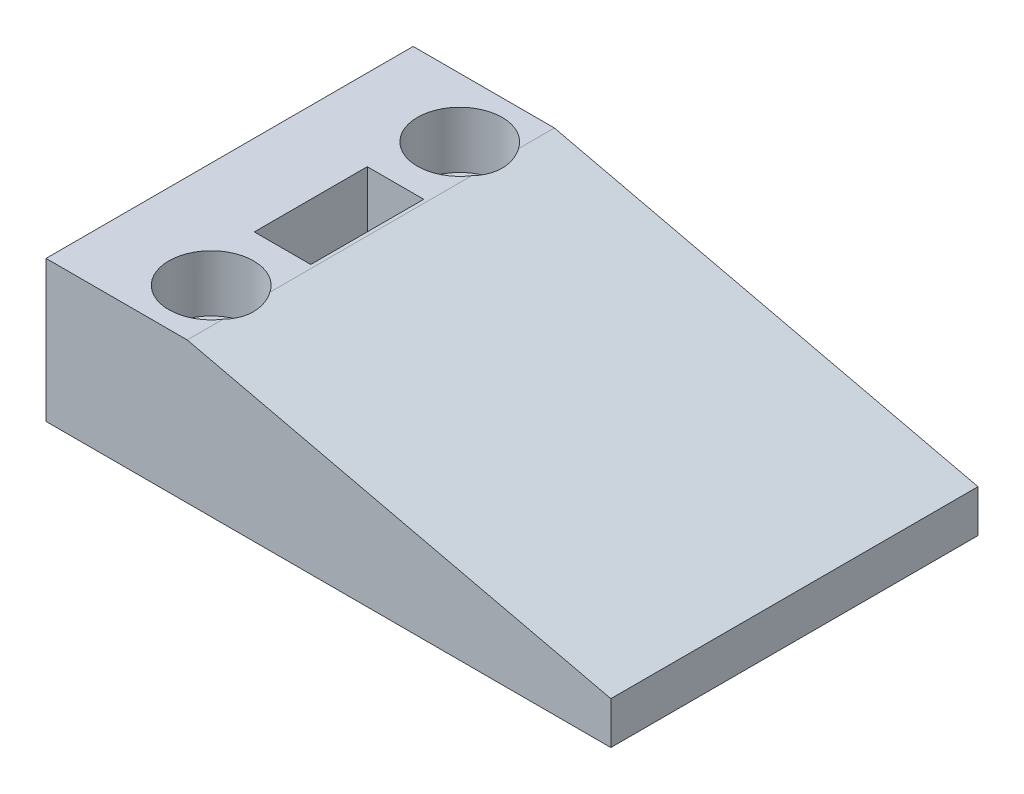
ISO-10303-21;
HEADER;
FILE_DESCRIPTION(('STEP AP214'),'2;1');
FILE_NAME('part.step','',(''),(''),'','','');
FILE_SCHEMA(('AUTOMOTIVE_DESIGN { 1 0 10303 214 1 1 1 1 }'));
ENDSEC;
DATA;
#1=APPLICATION_CONTEXT('core data for automotive mechanical design processes');
#2=APPLICATION_PROTOCOL_DEFINITION('international standard','automotive_design',2000,#1);
#3=PRODUCT_CONTEXT('',#1,'mechanical');
#4=PRODUCT('Part','Part','',(#3));
#5=PRODUCT_RELATED_PRODUCT_CATEGORY('part','',(#4));
#6=PRODUCT_DEFINITION_FORMATION('','',#4);
#7=PRODUCT_DEFINITION_CONTEXT('part definition',#1,'design');
#8=PRODUCT_DEFINITION('design','',#6,#7);
#9=PRODUCT_DEFINITION_SHAPE('','',#8);
#10=(LENGTH_UNIT() NAMED_UNIT(*) SI_UNIT(.MILLI.,.METRE.));
#11=(NAMED_UNIT(*) PLANE_ANGLE_UNIT() SI_UNIT($,.RADIAN.));
#12=(NAMED_UNIT(*) SI_UNIT($,.STERADIAN.) SOLID_ANGLE_UNIT());
#13=UNCERTAINTY_MEASURE_WITH_UNIT(LENGTH_MEASURE(1.E-05),#10,'distance_accuracy_value','');
#14=(GEOMETRIC_REPRESENTATION_CONTEXT(3) GLOBAL_UNCERTAINTY_ASSIGNED_CONTEXT((#13)) GLOBAL_UNIT_ASSIGNED_CONTEXT((#10,
#11,#12)) REPRESENTATION_CONTEXT('',''));
#15=CARTESIAN_POINT('',(0.,0.,0.));
#16=DIRECTION('',(0.,0.,1.));
#17=DIRECTION('',(1.,0.,0.));
#18=AXIS2_PLACEMENT_3D('',#15,#16,#17);
#19=CARTESIAN_POINT('',(7.5,10.,4.2));
#20=DIRECTION('',(0.,-1.,0.));
#21=DIRECTION('',(0.,0.,-1.));
#22=AXIS2_PLACEMENT_3D('',#19,#20,#21);
#23=CYLINDRICAL_SURFACE('',#22,1.725);
#24=CARTESIAN_POINT('',(7.5,0.,4.2));
#25=DIRECTION('',(0.,-1.,0.));
#26=DIRECTION('',(0.,0.,-1.));
#27=AXIS2_PLACEMENT_3D('',#24,#25,#26);
#28=CIRCLE('',#27,1.725);
#29=CARTESIAN_POINT('',(7.5,0.,2.475));
#30=VERTEX_POINT('',#29);
#31=EDGE_CURVE('E218',#30,#30,#28,.T.);
#32=ORIENTED_EDGE('',*,*,#31,.T.);
#33=EDGE_LOOP('',(#32));
#34=FACE_BOUND('',#33,.T.);
#35=CARTESIAN_POINT('',(7.5,6.,4.2));
#36=DIRECTION('',(0.,1.,0.));
#37=DIRECTION('',(-1.,0.,0.));
#38=AXIS2_PLACEMENT_3D('',#35,#36,#37);
#39=CIRCLE('',#38,1.725);
#40=CARTESIAN_POINT('',(5.775,6.,4.2));
#41=VERTEX_POINT('',#40);
#42=EDGE_CURVE('E45',#41,#41,#39,.F.);
#43=ORIENTED_EDGE('',*,*,#42,.F.);
#44=EDGE_LOOP('',(#43));
#45=FACE_BOUND('',#44,.T.);
#46=ADVANCED_FACE('F41',(#34,#45),#23,.F.);
#47=CARTESIAN_POINT('',(7.5,10.,21.8));
#48=DIRECTION('',(0.,-1.,0.));
#49=DIRECTION('',(0.,0.,-1.));
#50=AXIS2_PLACEMENT_3D('',#47,#48,#49);
#51=CYLINDRICAL_SURFACE('',#50,1.725);
#52=CARTESIAN_POINT('',(7.5,0.,21.8));
#53=DIRECTION('',(0.,-1.,0.));
#54=DIRECTION('',(0.,0.,-1.));
#55=AXIS2_PLACEMENT_3D('',#52,#53,#54);
#56=CIRCLE('',#55,1.725);
#57=CARTESIAN_POINT('',(7.5,0.,20.075));
#58=VERTEX_POINT('',#57);
#59=EDGE_CURVE('E172',#58,#58,#56,.T.);
#60=ORIENTED_EDGE('',*,*,#59,.T.);
#61=EDGE_LOOP('',(#60));
#62=FACE_BOUND('',#61,.T.);
#63=CARTESIAN_POINT('',(7.5,6.,21.8));
#64=DIRECTION('',(0.,1.,0.));
#65=DIRECTION('',(-1.,0.,0.));
#66=AXIS2_PLACEMENT_3D('',#63,#64,#65);
#67=CIRCLE('',#66,1.725);
#68=CARTESIAN_POINT('',(5.775,6.,21.8));
#69=VERTEX_POINT('',#68);
#70=EDGE_CURVE('E196',#69,#69,#67,.F.);
#71=ORIENTED_EDGE('',*,*,#70,.F.);
#72=EDGE_LOOP('',(#71));
#73=FACE_BOUND('',#72,.T.);
#74=ADVANCED_FACE('F305',(#62,#73),#51,.F.);
#75=CARTESIAN_POINT('',(2.72918861959958,11.6965226554268,26.));
#76=DIRECTION('',(0.227229615606418,0.973841209741793,0.));
#77=DIRECTION('',(-0.973841209741793,0.227229615606418,0.));
#78=AXIS2_PLACEMENT_3D('',#75,#76,#77);
#79=PLANE('',#78);
#80=CARTESIAN_POINT('',(7.5,10.5833333333333,4.2));
#81=DIRECTION('',(0.227229615606418,0.973841209741793,0.));
#82=DIRECTION('',(-0.973841209741793,0.227229615606418,0.));
#83=AXIS2_PLACEMENT_3D('',#80,#81,#82);
#84=ELLIPSE('',#83,3.08058436014987,3.);
#85=CARTESIAN_POINT('',(10.,10.,5.8583123951777));
#86=VERTEX_POINT('',#85);
#87=CARTESIAN_POINT('',(10.,10.,2.54168760482231));
#88=VERTEX_POINT('',#87);
#89=EDGE_CURVE('E59',#86,#88,#84,.T.);
#90=ORIENTED_EDGE('',*,*,#89,.F.);
#91=DIRECTION('',(0.,0.,-1.));
#92=VECTOR('',#91,1.);
#93=CARTESIAN_POINT('',(10.,10.,26.));
#94=LINE('',#93,#92);
#95=CARTESIAN_POINT('',(10.,10.,20.1416876048223));
#96=VERTEX_POINT('',#95);
#97=EDGE_CURVE('E51',#96,#86,#94,.T.);
#98=ORIENTED_EDGE('',*,*,#97,.F.);
#99=CARTESIAN_POINT('',(7.5,10.5833333333333,21.8));
#100=DIRECTION('',(0.227229615606418,0.973841209741793,0.));
#101=DIRECTION('',(-0.973841209741793,0.227229615606418,0.));
#102=AXIS2_PLACEMENT_3D('',#99,#100,#101);
#103=ELLIPSE('',#102,3.08058436014987,3.);
#104=CARTESIAN_POINT('',(10.,10.,23.4583123951777));
#105=VERTEX_POINT('',#104);
#106=EDGE_CURVE('E66',#105,#96,#103,.T.);
#107=ORIENTED_EDGE('',*,*,#106,.F.);
#108=CARTESIAN_POINT('',(10.,10.,26.));
#109=VERTEX_POINT('',#108);
#110=EDGE_CURVE('E11',#109,#105,#94,.T.);
#111=ORIENTED_EDGE('',*,*,#110,.F.);
#112=DIRECTION('',(0.973841209741793,-0.227229615606418,0.));
#113=VECTOR('',#112,1.);
#114=CARTESIAN_POINT('',(2.72918861959958,11.6965226554268,26.));
#115=LINE('',#114,#113);
#116=CARTESIAN_POINT('',(40.,3.,26.));
#117=VERTEX_POINT('',#116);
#118=EDGE_CURVE('E151',#109,#117,#115,.T.);
#119=ORIENTED_EDGE('',*,*,#118,.T.);
#120=DIRECTION('',(0.,0.,-1.));
#121=VECTOR('',#120,1.);
#122=CARTESIAN_POINT('',(40.,3.,26.));
#123=LINE('',#122,#121);
#124=CARTESIAN_POINT('',(40.,3.,0.));
#125=VERTEX_POINT('',#124);
#126=EDGE_CURVE('E166',#117,#125,#123,.T.);
#127=ORIENTED_EDGE('',*,*,#126,.T.);
#128=DIRECTION('',(0.973841209741793,-0.227229615606418,0.));
#129=VECTOR('',#128,1.);
#130=CARTESIAN_POINT('',(2.72918861959958,11.6965226554268,0.));
#131=LINE('',#130,#129);
#132=CARTESIAN_POINT('',(10.,10.,0.));
#133=VERTEX_POINT('',#132);
#134=EDGE_CURVE('E167',#133,#125,#131,.T.);
#135=ORIENTED_EDGE('',*,*,#134,.F.);
#136=EDGE_CURVE('E53',#88,#133,#94,.T.);
#137=ORIENTED_EDGE('',*,*,#136,.F.);
#138=EDGE_LOOP('',(#90,#98,#107,#111,#119,#127,#135,#137));
#139=FACE_BOUND('',#138,.T.);
#140=ADVANCED_FACE('F43',(#139),#79,.T.);
#141=CARTESIAN_POINT('',(0.,10.,26.));
#142=DIRECTION('',(0.,1.,0.));
#143=DIRECTION('',(-1.,0.,0.));
#144=AXIS2_PLACEMENT_3D('',#141,#142,#143);
#145=PLANE('',#144);
#146=CARTESIAN_POINT('',(7.5,10.,4.2));
#147=DIRECTION('',(0.,1.,0.));
#148=DIRECTION('',(-1.,0.,0.));
#149=AXIS2_PLACEMENT_3D('',#146,#147,#148);
#150=CIRCLE('',#149,3.);
#151=EDGE_CURVE('E206',#88,#86,#150,.T.);
#152=ORIENTED_EDGE('',*,*,#151,.F.);
#153=ORIENTED_EDGE('',*,*,#136,.T.);
#154=DIRECTION('',(1.,0.,0.));
#155=VECTOR('',#154,1.);
#156=CARTESIAN_POINT('',(0.,10.,0.));
#157=LINE('',#156,#155);
#158=CARTESIAN_POINT('',(0.,10.,0.));
#159=VERTEX_POINT('',#158);
#160=EDGE_CURVE('E171',#159,#133,#157,.T.);
#161=ORIENTED_EDGE('',*,*,#160,.F.);
#162=DIRECTION('',(0.,0.,-1.));
#163=VECTOR('',#162,1.);
#164=CARTESIAN_POINT('',(0.,10.,26.));
#165=LINE('',#164,#163);
#166=CARTESIAN_POINT('',(0.,10.,26.));
#167=VERTEX_POINT('',#166);
#168=EDGE_CURVE('E145',#167,#159,#165,.T.);
#169=ORIENTED_EDGE('',*,*,#168,.F.);
#170=DIRECTION('',(1.,0.,0.));
#171=VECTOR('',#170,1.);
#172=CARTESIAN_POINT('',(0.,10.,26.));
#173=LINE('',#172,#171);
#174=EDGE_CURVE('E143',#167,#109,#173,.T.);
#175=ORIENTED_EDGE('',*,*,#174,.T.);
#176=ORIENTED_EDGE('',*,*,#110,.T.);
#177=CARTESIAN_POINT('',(7.5,10.,21.8));
#178=DIRECTION('',(0.,1.,0.));
#179=DIRECTION('',(-1.,0.,0.));
#180=AXIS2_PLACEMENT_3D('',#177,#178,#179);
#181=CIRCLE('',#180,3.);
#182=EDGE_CURVE('E125',#96,#105,#181,.T.);
#183=ORIENTED_EDGE('',*,*,#182,.F.);
#184=ORIENTED_EDGE('',*,*,#97,.T.);
#185=EDGE_LOOP('',(#152,#153,#161,#169,#175,#176,#183,#184));
#186=FACE_BOUND('',#185,.T.);
#187=DIRECTION('',(0.,0.,-1.));
#188=VECTOR('',#187,1.);
#189=CARTESIAN_POINT('',(5.75,10.,17.));
#190=LINE('',#189,#188);
#191=CARTESIAN_POINT('',(5.75,10.,17.));
#192=VERTEX_POINT('',#191);
#193=CARTESIAN_POINT('',(5.75,10.,9.));
#194=VERTEX_POINT('',#193);
#195=EDGE_CURVE('E223',#192,#194,#190,.T.);
#196=ORIENTED_EDGE('',*,*,#195,.T.);
#197=DIRECTION('',(1.,0.,0.));
#198=VECTOR('',#197,1.);
#199=CARTESIAN_POINT('',(5.75,10.,9.));
#200=LINE('',#199,#198);
#201=CARTESIAN_POINT('',(9.75,10.,9.));
#202=VERTEX_POINT('',#201);
#203=EDGE_CURVE('E227',#194,#202,#200,.T.);
#204=ORIENTED_EDGE('',*,*,#203,.T.);
#205=DIRECTION('',(0.,0.,1.));
#206=VECTOR('',#205,1.);
#207=CARTESIAN_POINT('',(9.75,10.,17.));
#208=LINE('',#207,#206);
#209=CARTESIAN_POINT('',(9.75,10.,17.));
#210=VERTEX_POINT('',#209);
#211=EDGE_CURVE('E232',#202,#210,#208,.T.);
#212=ORIENTED_EDGE('',*,*,#211,.T.);
#213=DIRECTION('',(-1.,0.,0.));
#214=VECTOR('',#213,1.);
#215=CARTESIAN_POINT('',(5.75,10.,17.));
#216=LINE('',#215,#214);
#217=EDGE_CURVE('E236',#210,#192,#216,.T.);
#218=ORIENTED_EDGE('',*,*,#217,.T.);
#219=EDGE_LOOP('',(#196,#204,#212,#218));
#220=FACE_BOUND('',#219,.T.);
#221=ADVANCED_FACE('F140',(#186,#220),#145,.T.);
#222=CARTESIAN_POINT('',(0.,0.,26.));
#223=DIRECTION('',(-1.,0.,0.));
#224=DIRECTION('',(0.,0.,1.));
#225=AXIS2_PLACEMENT_3D('',#222,#223,#224);
#226=PLANE('',#225);
#227=DIRECTION('',(0.,1.,0.));
#228=VECTOR('',#227,1.);
#229=CARTESIAN_POINT('',(0.,0.,0.));
#230=LINE('',#229,#228);
#231=CARTESIAN_POINT('',(0.,0.,0.));
#232=VERTEX_POINT('',#231);
#233=EDGE_CURVE('E176',#232,#159,#230,.T.);
#234=ORIENTED_EDGE('',*,*,#233,.F.);
#235=DIRECTION('',(0.,0.,-1.));
#236=VECTOR('',#235,1.);
#237=CARTESIAN_POINT('',(0.,0.,26.));
#238=LINE('',#237,#236);
#239=CARTESIAN_POINT('',(0.,0.,26.));
#240=VERTEX_POINT('',#239);
#241=EDGE_CURVE('E192',#240,#232,#238,.T.);
#242=ORIENTED_EDGE('',*,*,#241,.F.);
#243=DIRECTION('',(0.,1.,0.));
#244=VECTOR('',#243,1.);
#245=CARTESIAN_POINT('',(0.,0.,26.));
#246=LINE('',#245,#244);
#247=EDGE_CURVE('E150',#240,#167,#246,.T.);
#248=ORIENTED_EDGE('',*,*,#247,.T.);
#249=ORIENTED_EDGE('',*,*,#168,.T.);
#250=EDGE_LOOP('',(#234,#242,#248,#249));
#251=FACE_BOUND('',#250,.T.);
#252=ADVANCED_FACE('F275',(#251),#226,.T.);
#253=CARTESIAN_POINT('',(0.,0.,26.));
#254=DIRECTION('',(0.,1.,0.));
#255=DIRECTION('',(0.,0.,1.));
#256=AXIS2_PLACEMENT_3D('',#253,#254,#255);
#257=PLANE('',#256);
#258=ORIENTED_EDGE('',*,*,#59,.F.);
#259=EDGE_LOOP('',(#258));
#260=FACE_BOUND('',#259,.T.);
#261=DIRECTION('',(1.,0.,0.));
#262=VECTOR('',#261,1.);
#263=CARTESIAN_POINT('',(5.75,0.,9.));
#264=LINE('',#263,#262);
#265=CARTESIAN_POINT('',(5.75,0.,9.));
#266=VERTEX_POINT('',#265);
#267=CARTESIAN_POINT('',(9.75,0.,9.));
#268=VERTEX_POINT('',#267);
#269=EDGE_CURVE('E244',#266,#268,#264,.T.);
#270=ORIENTED_EDGE('',*,*,#269,.F.);
#271=DIRECTION('',(0.,0.,-1.));
#272=VECTOR('',#271,1.);
#273=CARTESIAN_POINT('',(5.75,0.,17.));
#274=LINE('',#273,#272);
#275=CARTESIAN_POINT('',(5.75,0.,17.));
#276=VERTEX_POINT('',#275);
#277=EDGE_CURVE('E241',#276,#266,#274,.T.);
#278=ORIENTED_EDGE('',*,*,#277,.F.);
#279=DIRECTION('',(-1.,0.,0.));
#280=VECTOR('',#279,1.);
#281=CARTESIAN_POINT('',(5.75,0.,17.));
#282=LINE('',#281,#280);
#283=CARTESIAN_POINT('',(9.75,0.,17.));
#284=VERTEX_POINT('',#283);
#285=EDGE_CURVE('E228',#284,#276,#282,.T.);
#286=ORIENTED_EDGE('',*,*,#285,.F.);
#287=DIRECTION('',(0.,0.,1.));
#288=VECTOR('',#287,1.);
#289=CARTESIAN_POINT('',(9.75,0.,17.));
#290=LINE('',#289,#288);
#291=EDGE_CURVE('E248',#268,#284,#290,.T.);
#292=ORIENTED_EDGE('',*,*,#291,.F.);
#293=EDGE_LOOP('',(#270,#278,#286,#292));
#294=FACE_BOUND('',#293,.T.);
#295=ORIENTED_EDGE('',*,*,#31,.F.);
#296=EDGE_LOOP('',(#295));
#297=FACE_BOUND('',#296,.T.);
#298=DIRECTION('',(1.,0.,0.));
#299=VECTOR('',#298,1.);
#300=CARTESIAN_POINT('',(0.,0.,0.));
#301=LINE('',#300,#299);
#302=CARTESIAN_POINT('',(40.,0.,0.));
#303=VERTEX_POINT('',#302);
#304=EDGE_CURVE('E180',#232,#303,#301,.T.);
#305=ORIENTED_EDGE('',*,*,#304,.T.);
#306=DIRECTION('',(0.,0.,-1.));
#307=VECTOR('',#306,1.);
#308=CARTESIAN_POINT('',(40.,0.,26.));
#309=LINE('',#308,#307);
#310=CARTESIAN_POINT('',(40.,0.,26.));
#311=VERTEX_POINT('',#310);
#312=EDGE_CURVE('E188',#311,#303,#309,.T.);
#313=ORIENTED_EDGE('',*,*,#312,.F.);
#314=DIRECTION('',(1.,0.,0.));
#315=VECTOR('',#314,1.);
#316=CARTESIAN_POINT('',(0.,0.,26.));
#317=LINE('',#316,#315);
#318=EDGE_CURVE('E155',#240,#311,#317,.T.);
#319=ORIENTED_EDGE('',*,*,#318,.F.);
#320=ORIENTED_EDGE('',*,*,#241,.T.);
#321=EDGE_LOOP('',(#305,#313,#319,#320));
#322=FACE_BOUND('',#321,.T.);
#323=ADVANCED_FACE('F271',(#260,#294,#297,#322),#257,.F.);
#324=CARTESIAN_POINT('',(40.,0.,26.));
#325=DIRECTION('',(-1.,0.,0.));
#326=DIRECTION('',(0.,0.,1.));
#327=AXIS2_PLACEMENT_3D('',#324,#325,#326);
#328=PLANE('',#327);
#329=DIRECTION('',(0.,1.,0.));
#330=VECTOR('',#329,1.);
#331=CARTESIAN_POINT('',(40.,0.,0.));
#332=LINE('',#331,#330);
#333=EDGE_CURVE('E157',#303,#125,#332,.T.);
#334=ORIENTED_EDGE('',*,*,#333,.T.);
#335=ORIENTED_EDGE('',*,*,#126,.F.);
#336=DIRECTION('',(0.,1.,0.));
#337=VECTOR('',#336,1.);
#338=CARTESIAN_POINT('',(40.,0.,26.));
#339=LINE('',#338,#337);
#340=EDGE_CURVE('E163',#311,#117,#339,.T.);
#341=ORIENTED_EDGE('',*,*,#340,.F.);
#342=ORIENTED_EDGE('',*,*,#312,.T.);
#343=EDGE_LOOP('',(#334,#335,#341,#342));
#344=FACE_BOUND('',#343,.T.);
#345=ADVANCED_FACE('F274',(#344),#328,.F.);
#346=CARTESIAN_POINT('',(0.,0.,26.));
#347=DIRECTION('',(0.,0.,1.));
#348=DIRECTION('',(1.,0.,0.));
#349=AXIS2_PLACEMENT_3D('',#346,#347,#348);
#350=PLANE('',#349);
#351=ORIENTED_EDGE('',*,*,#118,.F.);
#352=ORIENTED_EDGE('',*,*,#174,.F.);
#353=ORIENTED_EDGE('',*,*,#247,.F.);
#354=ORIENTED_EDGE('',*,*,#318,.T.);
#355=ORIENTED_EDGE('',*,*,#340,.T.);
#356=EDGE_LOOP('',(#351,#352,#353,#354,#355));
#357=FACE_BOUND('',#356,.T.);
#358=ADVANCED_FACE('F290',(#357),#350,.T.);
#359=CARTESIAN_POINT('',(0.,0.,0.));
#360=DIRECTION('',(0.,0.,1.));
#361=DIRECTION('',(1.,0.,0.));
#362=AXIS2_PLACEMENT_3D('',#359,#360,#361);
#363=PLANE('',#362);
#364=ORIENTED_EDGE('',*,*,#134,.T.);
#365=ORIENTED_EDGE('',*,*,#333,.F.);
#366=ORIENTED_EDGE('',*,*,#304,.F.);
#367=ORIENTED_EDGE('',*,*,#233,.T.);
#368=ORIENTED_EDGE('',*,*,#160,.T.);
#369=EDGE_LOOP('',(#364,#365,#366,#367,#368));
#370=FACE_BOUND('',#369,.T.);
#371=ADVANCED_FACE('F287',(#370),#363,.F.);
#372=CARTESIAN_POINT('',(5.75,10.,17.));
#373=DIRECTION('',(-1.,0.,0.));
#374=DIRECTION('',(0.,0.,1.));
#375=AXIS2_PLACEMENT_3D('',#372,#373,#374);
#376=PLANE('',#375);
#377=ORIENTED_EDGE('',*,*,#277,.T.);
#378=DIRECTION('',(0.,-1.,0.));
#379=VECTOR('',#378,1.);
#380=CARTESIAN_POINT('',(5.75,10.,9.));
#381=LINE('',#380,#379);
#382=EDGE_CURVE('E240',#194,#266,#381,.T.);
#383=ORIENTED_EDGE('',*,*,#382,.F.);
#384=ORIENTED_EDGE('',*,*,#195,.F.);
#385=DIRECTION('',(0.,-1.,0.));
#386=VECTOR('',#385,1.);
#387=CARTESIAN_POINT('',(5.75,10.,17.));
#388=LINE('',#387,#386);
#389=EDGE_CURVE('E222',#192,#276,#388,.T.);
#390=ORIENTED_EDGE('',*,*,#389,.T.);
#391=EDGE_LOOP('',(#377,#383,#384,#390));
#392=FACE_BOUND('',#391,.T.);
#393=ADVANCED_FACE('F314',(#392),#376,.F.);
#394=CARTESIAN_POINT('',(5.75,10.,17.));
#395=DIRECTION('',(0.,0.,1.));
#396=DIRECTION('',(1.,0.,0.));
#397=AXIS2_PLACEMENT_3D('',#394,#395,#396);
#398=PLANE('',#397);
#399=ORIENTED_EDGE('',*,*,#285,.T.);
#400=ORIENTED_EDGE('',*,*,#389,.F.);
#401=ORIENTED_EDGE('',*,*,#217,.F.);
#402=DIRECTION('',(0.,-1.,0.));
#403=VECTOR('',#402,1.);
#404=CARTESIAN_POINT('',(9.75,10.,17.));
#405=LINE('',#404,#403);
#406=EDGE_CURVE('E257',#210,#284,#405,.T.);
#407=ORIENTED_EDGE('',*,*,#406,.T.);
#408=EDGE_LOOP('',(#399,#400,#401,#407));
#409=FACE_BOUND('',#408,.T.);
#410=ADVANCED_FACE('F359',(#409),#398,.F.);
#411=CARTESIAN_POINT('',(9.75,10.,17.));
#412=DIRECTION('',(1.,0.,0.));
#413=DIRECTION('',(0.,0.,-1.));
#414=AXIS2_PLACEMENT_3D('',#411,#412,#413);
#415=PLANE('',#414);
#416=ORIENTED_EDGE('',*,*,#291,.T.);
#417=ORIENTED_EDGE('',*,*,#406,.F.);
#418=ORIENTED_EDGE('',*,*,#211,.F.);
#419=DIRECTION('',(0.,-1.,0.));
#420=VECTOR('',#419,1.);
#421=CARTESIAN_POINT('',(9.75,10.,9.));
#422=LINE('',#421,#420);
#423=EDGE_CURVE('E260',#202,#268,#422,.T.);
#424=ORIENTED_EDGE('',*,*,#423,.T.);
#425=EDGE_LOOP('',(#416,#417,#418,#424));
#426=FACE_BOUND('',#425,.T.);
#427=ADVANCED_FACE('F349',(#426),#415,.F.);
#428=CARTESIAN_POINT('',(5.75,10.,9.));
#429=DIRECTION('',(0.,0.,-1.));
#430=DIRECTION('',(-1.,0.,0.));
#431=AXIS2_PLACEMENT_3D('',#428,#429,#430);
#432=PLANE('',#431);
#433=ORIENTED_EDGE('',*,*,#269,.T.);
#434=ORIENTED_EDGE('',*,*,#423,.F.);
#435=ORIENTED_EDGE('',*,*,#203,.F.);
#436=ORIENTED_EDGE('',*,*,#382,.T.);
#437=EDGE_LOOP('',(#433,#434,#435,#436));
#438=FACE_BOUND('',#437,.T.);
#439=ADVANCED_FACE('F344',(#438),#432,.F.);
#440=CARTESIAN_POINT('',(7.5,6.,21.8));
#441=DIRECTION('',(0.,1.,0.));
#442=DIRECTION('',(-1.,0.,0.));
#443=AXIS2_PLACEMENT_3D('',#440,#441,#442);
#444=PLANE('',#443);
#445=CARTESIAN_POINT('',(7.5,6.,21.8));
#446=DIRECTION('',(0.,1.,0.));
#447=DIRECTION('',(-1.,0.,0.));
#448=AXIS2_PLACEMENT_3D('',#445,#446,#447);
#449=CIRCLE('',#448,3.);
#450=CARTESIAN_POINT('',(4.5,6.,21.8));
#451=VERTEX_POINT('',#450);
#452=EDGE_CURVE('E132',#451,#451,#449,.T.);
#453=ORIENTED_EDGE('',*,*,#452,.T.);
#454=EDGE_LOOP('',(#453));
#455=FACE_BOUND('',#454,.T.);
#456=ORIENTED_EDGE('',*,*,#70,.T.);
#457=EDGE_LOOP('',(#456));
#458=FACE_BOUND('',#457,.T.);
#459=ADVANCED_FACE('F348',(#455,#458),#444,.T.);
#460=CARTESIAN_POINT('',(7.5,6.,21.8));
#461=DIRECTION('',(0.,1.,0.));
#462=DIRECTION('',(-1.,0.,0.));
#463=AXIS2_PLACEMENT_3D('',#460,#461,#462);
#464=CYLINDRICAL_SURFACE('',#463,3.);
#465=ORIENTED_EDGE('',*,*,#106,.T.);
#466=ORIENTED_EDGE('',*,*,#182,.T.);
#467=EDGE_LOOP('',(#465,#466));
#468=FACE_BOUND('',#467,.T.);
#469=ORIENTED_EDGE('',*,*,#452,.F.);
#470=EDGE_LOOP('',(#469));
#471=FACE_BOUND('',#470,.T.);
#472=ADVANCED_FACE('F126',(#468,#471),#464,.F.);
#473=CARTESIAN_POINT('',(7.5,6.,4.2));
#474=DIRECTION('',(0.,1.,0.));
#475=DIRECTION('',(-1.,0.,0.));
#476=AXIS2_PLACEMENT_3D('',#473,#474,#475);
#477=PLANE('',#476);
#478=CARTESIAN_POINT('',(7.5,6.,4.2));
#479=DIRECTION('',(0.,1.,0.));
#480=DIRECTION('',(-1.,0.,0.));
#481=AXIS2_PLACEMENT_3D('',#478,#479,#480);
#482=CIRCLE('',#481,3.);
#483=CARTESIAN_POINT('',(4.5,6.,4.2));
#484=VERTEX_POINT('',#483);
#485=EDGE_CURVE('E199',#484,#484,#482,.T.);
#486=ORIENTED_EDGE('',*,*,#485,.T.);
#487=EDGE_LOOP('',(#486));
#488=FACE_BOUND('',#487,.T.);
#489=ORIENTED_EDGE('',*,*,#42,.T.);
#490=EDGE_LOOP('',(#489));
#491=FACE_BOUND('',#490,.T.);
#492=ADVANCED_FACE('F297',(#488,#491),#477,.T.);
#493=CARTESIAN_POINT('',(7.5,6.,4.2));
#494=DIRECTION('',(0.,1.,0.));
#495=DIRECTION('',(-1.,0.,0.));
#496=AXIS2_PLACEMENT_3D('',#493,#494,#495);
#497=CYLINDRICAL_SURFACE('',#496,3.);
#498=ORIENTED_EDGE('',*,*,#89,.T.);
#499=ORIENTED_EDGE('',*,*,#151,.T.);
#500=EDGE_LOOP('',(#498,#499));
#501=FACE_BOUND('',#500,.T.);
#502=ORIENTED_EDGE('',*,*,#485,.F.);
#503=EDGE_LOOP('',(#502));
#504=FACE_BOUND('',#503,.T.);
#505=ADVANCED_FACE('F294',(#501,#504),#497,.F.);
#506=CLOSED_SHELL('',(#46,#74,#140,#221,#252,#323,#345,#358,#371,#393,#410,#427,#439,#459,#472,
#492,#505));
#507=MANIFOLD_SOLID_BREP('B2',#506);
#508=ADVANCED_BREP_SHAPE_REPRESENTATION('',(#18,#507),#14);
#509=SHAPE_DEFINITION_REPRESENTATION(#9,#508);
ENDSEC;
END-ISO-10303-21;
